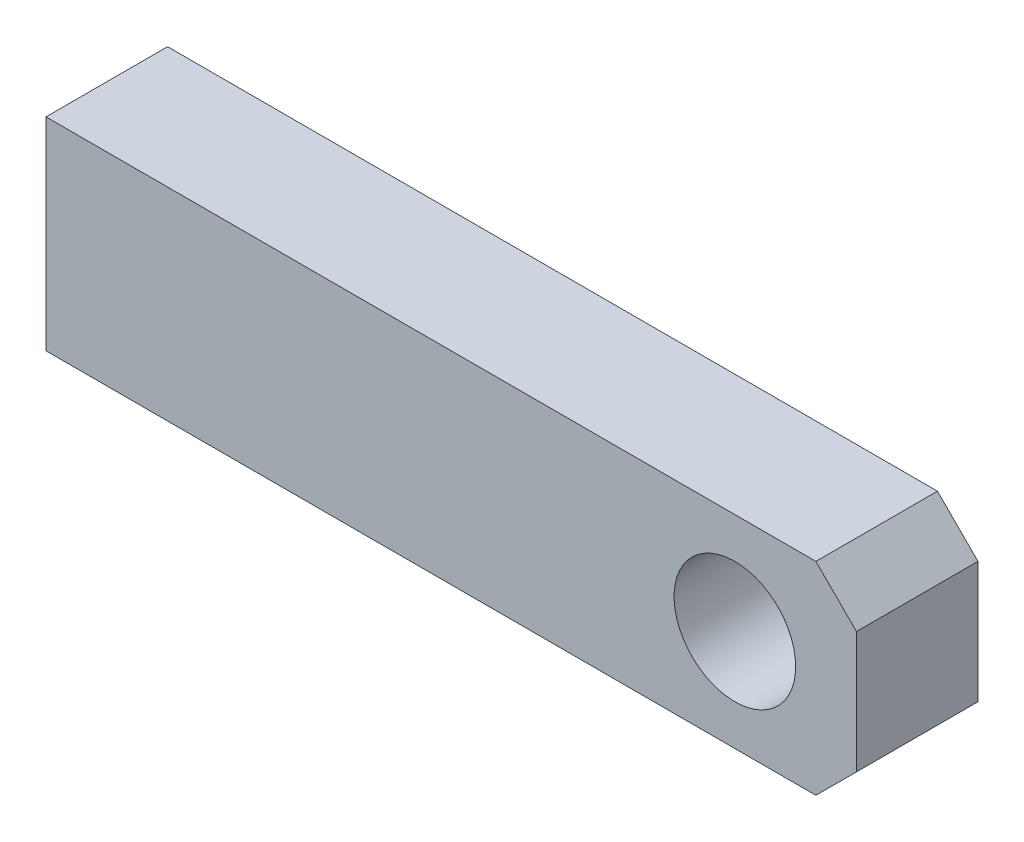
ISO-10303-21;
HEADER;
FILE_DESCRIPTION(('STEP AP214'),'2;1');
FILE_NAME('part.step','',(''),(''),'','','');
FILE_SCHEMA(('AUTOMOTIVE_DESIGN { 1 0 10303 214 1 1 1 1 }'));
ENDSEC;
DATA;
#1=APPLICATION_CONTEXT('core data for automotive mechanical design processes');
#2=APPLICATION_PROTOCOL_DEFINITION('international standard','automotive_design',2000,#1);
#3=PRODUCT_CONTEXT('',#1,'mechanical');
#4=PRODUCT('Part','Part','',(#3));
#5=PRODUCT_RELATED_PRODUCT_CATEGORY('part','',(#4));
#6=PRODUCT_DEFINITION_FORMATION('','',#4);
#7=PRODUCT_DEFINITION_CONTEXT('part definition',#1,'design');
#8=PRODUCT_DEFINITION('design','',#6,#7);
#9=PRODUCT_DEFINITION_SHAPE('','',#8);
#10=(LENGTH_UNIT() NAMED_UNIT(*) SI_UNIT(.MILLI.,.METRE.));
#11=(NAMED_UNIT(*) PLANE_ANGLE_UNIT() SI_UNIT($,.RADIAN.));
#12=(NAMED_UNIT(*) SI_UNIT($,.STERADIAN.) SOLID_ANGLE_UNIT());
#13=UNCERTAINTY_MEASURE_WITH_UNIT(LENGTH_MEASURE(1.E-05),#10,'distance_accuracy_value','');
#14=(GEOMETRIC_REPRESENTATION_CONTEXT(3) GLOBAL_UNCERTAINTY_ASSIGNED_CONTEXT((#13)) GLOBAL_UNIT_ASSIGNED_CONTEXT((#10,
#11,#12)) REPRESENTATION_CONTEXT('',''));
#15=CARTESIAN_POINT('',(0.,0.,0.));
#16=DIRECTION('',(0.,0.,1.));
#17=DIRECTION('',(1.,0.,0.));
#18=AXIS2_PLACEMENT_3D('',#15,#16,#17);
#19=CARTESIAN_POINT('',(3.54639650011513,2.06976744186047,3.));
#20=DIRECTION('',(-1.,0.,0.));
#21=DIRECTION('',(0.,-1.,0.));
#22=AXIS2_PLACEMENT_3D('',#19,#20,#21);
#23=PLANE('',#22);
#24=DIRECTION('',(0.,1.,0.));
#25=VECTOR('',#24,1.);
#26=CARTESIAN_POINT('',(3.54639650011513,2.06976744186047,0.));
#27=LINE('',#26,#25);
#28=CARTESIAN_POINT('',(3.54639650011513,-1.93023255813953,0.));
#29=VERTEX_POINT('',#28);
#30=CARTESIAN_POINT('',(3.54639650011513,1.06976744186046,0.));
#31=VERTEX_POINT('',#30);
#32=EDGE_CURVE('E123',#29,#31,#27,.T.);
#33=ORIENTED_EDGE('',*,*,#32,.T.);
#34=DIRECTION('',(0.,0.,1.));
#35=VECTOR('',#34,1.);
#36=CARTESIAN_POINT('',(3.54639650011513,1.06976744186046,3.));
#37=LINE('',#36,#35);
#38=CARTESIAN_POINT('',(3.54639650011513,1.06976744186046,3.));
#39=VERTEX_POINT('',#38);
#40=EDGE_CURVE('E49',#31,#39,#37,.T.);
#41=ORIENTED_EDGE('',*,*,#40,.T.);
#42=DIRECTION('',(0.,1.,0.));
#43=VECTOR('',#42,1.);
#44=CARTESIAN_POINT('',(3.54639650011513,2.06976744186047,3.));
#45=LINE('',#44,#43);
#46=CARTESIAN_POINT('',(3.54639650011513,-1.93023255813953,3.));
#47=VERTEX_POINT('',#46);
#48=EDGE_CURVE('E104',#47,#39,#45,.T.);
#49=ORIENTED_EDGE('',*,*,#48,.F.);
#50=DIRECTION('',(0.,0.,-1.));
#51=VECTOR('',#50,1.);
#52=CARTESIAN_POINT('',(3.54639650011513,-1.93023255813953,3.));
#53=LINE('',#52,#51);
#54=EDGE_CURVE('E112',#47,#29,#53,.T.);
#55=ORIENTED_EDGE('',*,*,#54,.T.);
#56=EDGE_LOOP('',(#33,#41,#49,#55));
#57=FACE_BOUND('',#56,.T.);
#58=ADVANCED_FACE('F40',(#57),#23,.F.);
#59=CARTESIAN_POINT('',(-16.4536034998849,2.06976744186047,3.));
#60=DIRECTION('',(0.,-1.,0.));
#61=DIRECTION('',(0.,0.,-1.));
#62=AXIS2_PLACEMENT_3D('',#59,#60,#61);
#63=PLANE('',#62);
#64=DIRECTION('',(-1.,0.,0.));
#65=VECTOR('',#64,1.);
#66=CARTESIAN_POINT('',(-16.4536034998849,2.06976744186047,3.));
#67=LINE('',#66,#65);
#68=CARTESIAN_POINT('',(2.54639650011513,2.06976744186047,3.));
#69=VERTEX_POINT('',#68);
#70=CARTESIAN_POINT('',(-16.4536034998849,2.06976744186047,3.));
#71=VERTEX_POINT('',#70);
#72=EDGE_CURVE('E93',#69,#71,#67,.T.);
#73=ORIENTED_EDGE('',*,*,#72,.F.);
#74=DIRECTION('',(0.,0.,-1.));
#75=VECTOR('',#74,1.);
#76=CARTESIAN_POINT('',(2.54639650011513,2.06976744186047,3.));
#77=LINE('',#76,#75);
#78=CARTESIAN_POINT('',(2.54639650011513,2.06976744186047,0.));
#79=VERTEX_POINT('',#78);
#80=EDGE_CURVE('E141',#69,#79,#77,.T.);
#81=ORIENTED_EDGE('',*,*,#80,.T.);
#82=DIRECTION('',(-1.,0.,0.));
#83=VECTOR('',#82,1.);
#84=CARTESIAN_POINT('',(-16.4536034998849,2.06976744186047,0.));
#85=LINE('',#84,#83);
#86=CARTESIAN_POINT('',(-16.4536034998849,2.06976744186047,0.));
#87=VERTEX_POINT('',#86);
#88=EDGE_CURVE('E109',#79,#87,#85,.T.);
#89=ORIENTED_EDGE('',*,*,#88,.T.);
#90=DIRECTION('',(0.,0.,-1.));
#91=VECTOR('',#90,1.);
#92=CARTESIAN_POINT('',(-16.4536034998849,2.06976744186047,3.));
#93=LINE('',#92,#91);
#94=EDGE_CURVE('E107',#71,#87,#93,.T.);
#95=ORIENTED_EDGE('',*,*,#94,.F.);
#96=EDGE_LOOP('',(#73,#81,#89,#95));
#97=FACE_BOUND('',#96,.T.);
#98=ADVANCED_FACE('F108',(#97),#63,.F.);
#99=CARTESIAN_POINT('',(-16.4536034998849,2.06976744186047,3.));
#100=DIRECTION('',(1.,0.,0.));
#101=DIRECTION('',(0.,0.,-1.));
#102=AXIS2_PLACEMENT_3D('',#99,#100,#101);
#103=PLANE('',#102);
#104=DIRECTION('',(0.,-1.,0.));
#105=VECTOR('',#104,1.);
#106=CARTESIAN_POINT('',(-16.4536034998849,2.06976744186047,0.));
#107=LINE('',#106,#105);
#108=CARTESIAN_POINT('',(-16.4536034998849,-2.93023255813953,0.));
#109=VERTEX_POINT('',#108);
#110=EDGE_CURVE('E127',#87,#109,#107,.T.);
#111=ORIENTED_EDGE('',*,*,#110,.T.);
#112=DIRECTION('',(0.,0.,-1.));
#113=VECTOR('',#112,1.);
#114=CARTESIAN_POINT('',(-16.4536034998849,-2.93023255813953,3.));
#115=LINE('',#114,#113);
#116=CARTESIAN_POINT('',(-16.4536034998849,-2.93023255813953,3.));
#117=VERTEX_POINT('',#116);
#118=EDGE_CURVE('E113',#117,#109,#115,.T.);
#119=ORIENTED_EDGE('',*,*,#118,.F.);
#120=DIRECTION('',(0.,-1.,0.));
#121=VECTOR('',#120,1.);
#122=CARTESIAN_POINT('',(-16.4536034998849,2.06976744186047,3.));
#123=LINE('',#122,#121);
#124=EDGE_CURVE('E98',#71,#117,#123,.T.);
#125=ORIENTED_EDGE('',*,*,#124,.F.);
#126=ORIENTED_EDGE('',*,*,#94,.T.);
#127=EDGE_LOOP('',(#111,#119,#125,#126));
#128=FACE_BOUND('',#127,.T.);
#129=ADVANCED_FACE('F115',(#128),#103,.F.);
#130=CARTESIAN_POINT('',(-16.4536034998849,-2.93023255813953,3.));
#131=DIRECTION('',(0.,1.,0.));
#132=DIRECTION('',(0.,0.,1.));
#133=AXIS2_PLACEMENT_3D('',#130,#131,#132);
#134=PLANE('',#133);
#135=DIRECTION('',(1.,0.,0.));
#136=VECTOR('',#135,1.);
#137=CARTESIAN_POINT('',(-16.4536034998849,-2.93023255813953,0.));
#138=LINE('',#137,#136);
#139=CARTESIAN_POINT('',(2.54639650011513,-2.93023255813953,0.));
#140=VERTEX_POINT('',#139);
#141=EDGE_CURVE('E129',#109,#140,#138,.T.);
#142=ORIENTED_EDGE('',*,*,#141,.T.);
#143=DIRECTION('',(0.,0.,1.));
#144=VECTOR('',#143,1.);
#145=CARTESIAN_POINT('',(2.54639650011513,-2.93023255813953,3.));
#146=LINE('',#145,#144);
#147=CARTESIAN_POINT('',(2.54639650011513,-2.93023255813953,3.));
#148=VERTEX_POINT('',#147);
#149=EDGE_CURVE('E137',#140,#148,#146,.T.);
#150=ORIENTED_EDGE('',*,*,#149,.T.);
#151=DIRECTION('',(1.,0.,0.));
#152=VECTOR('',#151,1.);
#153=CARTESIAN_POINT('',(-16.4536034998849,-2.93023255813953,3.));
#154=LINE('',#153,#152);
#155=EDGE_CURVE('E118',#117,#148,#154,.T.);
#156=ORIENTED_EDGE('',*,*,#155,.F.);
#157=ORIENTED_EDGE('',*,*,#118,.T.);
#158=EDGE_LOOP('',(#142,#150,#156,#157));
#159=FACE_BOUND('',#158,.T.);
#160=ADVANCED_FACE('F147',(#159),#134,.F.);
#161=CARTESIAN_POINT('',(0.,0.,3.));
#162=DIRECTION('',(0.,0.,1.));
#163=DIRECTION('',(1.,0.,0.));
#164=AXIS2_PLACEMENT_3D('',#161,#162,#163);
#165=PLANE('',#164);
#166=CARTESIAN_POINT('',(0.546396500115132,-0.430232558139535,3.));
#167=DIRECTION('',(0.,0.,1.));
#168=DIRECTION('',(1.,0.,0.));
#169=AXIS2_PLACEMENT_3D('',#166,#167,#168);
#170=CIRCLE('',#169,1.5);
#171=CARTESIAN_POINT('',(2.04639650011513,-0.430232558139535,3.));
#172=VERTEX_POINT('',#171);
#173=EDGE_CURVE('E154',#172,#172,#170,.T.);
#174=ORIENTED_EDGE('',*,*,#173,.F.);
#175=EDGE_LOOP('',(#174));
#176=FACE_BOUND('',#175,.T.);
#177=ORIENTED_EDGE('',*,*,#48,.T.);
#178=DIRECTION('',(0.707106781186546,-0.707106781186549,0.));
#179=VECTOR('',#178,1.);
#180=CARTESIAN_POINT('',(2.3080819709878,2.3080819709878,3.));
#181=LINE('',#180,#179);
#182=EDGE_CURVE('E11',#39,#69,#181,.F.);
#183=ORIENTED_EDGE('',*,*,#182,.T.);
#184=ORIENTED_EDGE('',*,*,#72,.T.);
#185=ORIENTED_EDGE('',*,*,#124,.T.);
#186=ORIENTED_EDGE('',*,*,#155,.T.);
#187=DIRECTION('',(-0.707106781186549,-0.707106781186546,0.));
#188=VECTOR('',#187,1.);
#189=CARTESIAN_POINT('',(2.73831452912733,-2.73831452912734,3.));
#190=LINE('',#189,#188);
#191=EDGE_CURVE('E139',#148,#47,#190,.F.);
#192=ORIENTED_EDGE('',*,*,#191,.T.);
#193=EDGE_LOOP('',(#177,#183,#184,#185,#186,#192));
#194=FACE_BOUND('',#193,.T.);
#195=ADVANCED_FACE('F95',(#176,#194),#165,.T.);
#196=CARTESIAN_POINT('',(0.,0.,0.));
#197=DIRECTION('',(0.,0.,1.));
#198=DIRECTION('',(1.,0.,0.));
#199=AXIS2_PLACEMENT_3D('',#196,#197,#198);
#200=PLANE('',#199);
#201=CARTESIAN_POINT('',(0.546396500115132,-0.430232558139535,0.));
#202=DIRECTION('',(0.,0.,1.));
#203=DIRECTION('',(1.,0.,0.));
#204=AXIS2_PLACEMENT_3D('',#201,#202,#203);
#205=CIRCLE('',#204,1.5);
#206=CARTESIAN_POINT('',(2.04639650011513,-0.430232558139535,0.));
#207=VERTEX_POINT('',#206);
#208=EDGE_CURVE('E125',#207,#207,#205,.T.);
#209=ORIENTED_EDGE('',*,*,#208,.T.);
#210=EDGE_LOOP('',(#209));
#211=FACE_BOUND('',#210,.T.);
#212=ORIENTED_EDGE('',*,*,#88,.F.);
#213=DIRECTION('',(-0.707106781186546,0.707106781186549,0.));
#214=VECTOR('',#213,1.);
#215=CARTESIAN_POINT('',(2.54639650011513,2.06976744186047,0.));
#216=LINE('',#215,#214);
#217=EDGE_CURVE('E63',#79,#31,#216,.F.);
#218=ORIENTED_EDGE('',*,*,#217,.T.);
#219=ORIENTED_EDGE('',*,*,#32,.F.);
#220=DIRECTION('',(0.707106781186549,0.707106781186546,0.));
#221=VECTOR('',#220,1.);
#222=CARTESIAN_POINT('',(3.54639650011513,-1.93023255813953,0.));
#223=LINE('',#222,#221);
#224=EDGE_CURVE('E135',#29,#140,#223,.F.);
#225=ORIENTED_EDGE('',*,*,#224,.T.);
#226=ORIENTED_EDGE('',*,*,#141,.F.);
#227=ORIENTED_EDGE('',*,*,#110,.F.);
#228=EDGE_LOOP('',(#212,#218,#219,#225,#226,#227));
#229=FACE_BOUND('',#228,.T.);
#230=ADVANCED_FACE('F144',(#211,#229),#200,.F.);
#231=CARTESIAN_POINT('',(0.546396500115132,-0.430232558139535,0.));
#232=DIRECTION('',(0.,0.,1.));
#233=DIRECTION('',(1.,0.,0.));
#234=AXIS2_PLACEMENT_3D('',#231,#232,#233);
#235=CYLINDRICAL_SURFACE('',#234,1.5);
#236=ORIENTED_EDGE('',*,*,#208,.F.);
#237=EDGE_LOOP('',(#236));
#238=FACE_BOUND('',#237,.T.);
#239=ORIENTED_EDGE('',*,*,#173,.T.);
#240=EDGE_LOOP('',(#239));
#241=FACE_BOUND('',#240,.T.);
#242=ADVANCED_FACE('F161',(#238,#241),#235,.F.);
#243=CARTESIAN_POINT('',(3.54639650011513,-1.93023255813953,3.));
#244=DIRECTION('',(-0.707106781186546,0.707106781186549,0.));
#245=DIRECTION('',(0.,0.,-1.));
#246=AXIS2_PLACEMENT_3D('',#243,#244,#245);
#247=PLANE('',#246);
#248=ORIENTED_EDGE('',*,*,#191,.F.);
#249=ORIENTED_EDGE('',*,*,#149,.F.);
#250=ORIENTED_EDGE('',*,*,#224,.F.);
#251=ORIENTED_EDGE('',*,*,#54,.F.);
#252=EDGE_LOOP('',(#248,#249,#250,#251));
#253=FACE_BOUND('',#252,.T.);
#254=ADVANCED_FACE('F152',(#253),#247,.F.);
#255=CARTESIAN_POINT('',(2.54639650011513,2.06976744186047,3.));
#256=DIRECTION('',(-0.707106781186549,-0.707106781186546,0.));
#257=DIRECTION('',(0.,0.,-1.));
#258=AXIS2_PLACEMENT_3D('',#255,#256,#257);
#259=PLANE('',#258);
#260=ORIENTED_EDGE('',*,*,#182,.F.);
#261=ORIENTED_EDGE('',*,*,#40,.F.);
#262=ORIENTED_EDGE('',*,*,#217,.F.);
#263=ORIENTED_EDGE('',*,*,#80,.F.);
#264=EDGE_LOOP('',(#260,#261,#262,#263));
#265=FACE_BOUND('',#264,.T.);
#266=ADVANCED_FACE('F43',(#265),#259,.F.);
#267=CLOSED_SHELL('',(#58,#98,#129,#160,#195,#230,#242,#254,#266));
#268=MANIFOLD_SOLID_BREP('B2',#267);
#269=ADVANCED_BREP_SHAPE_REPRESENTATION('',(#18,#268),#14);
#270=SHAPE_DEFINITION_REPRESENTATION(#9,#269);
ENDSEC;
END-ISO-10303-21;
